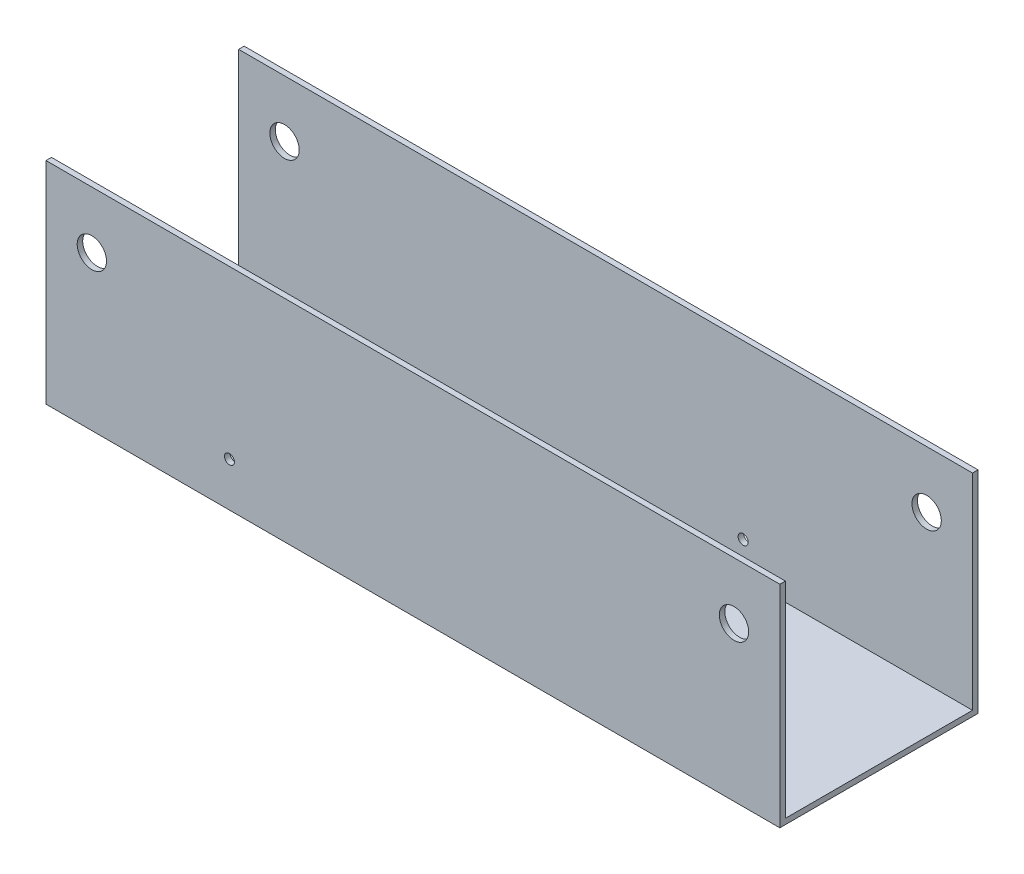
ISO-10303-21;
HEADER;
FILE_DESCRIPTION(('STEP AP214'),'2;1');
FILE_NAME('part.step','',(''),(''),'','','');
FILE_SCHEMA(('AUTOMOTIVE_DESIGN { 1 0 10303 214 1 1 1 1 }'));
ENDSEC;
DATA;
#1=APPLICATION_CONTEXT('core data for automotive mechanical design processes');
#2=APPLICATION_PROTOCOL_DEFINITION('international standard','automotive_design',2000,#1);
#3=PRODUCT_CONTEXT('',#1,'mechanical');
#4=PRODUCT('Part','Part','',(#3));
#5=PRODUCT_RELATED_PRODUCT_CATEGORY('part','',(#4));
#6=PRODUCT_DEFINITION_FORMATION('','',#4);
#7=PRODUCT_DEFINITION_CONTEXT('part definition',#1,'design');
#8=PRODUCT_DEFINITION('design','',#6,#7);
#9=PRODUCT_DEFINITION_SHAPE('','',#8);
#10=(LENGTH_UNIT() NAMED_UNIT(*) SI_UNIT(.MILLI.,.METRE.));
#11=(NAMED_UNIT(*) PLANE_ANGLE_UNIT() SI_UNIT($,.RADIAN.));
#12=(NAMED_UNIT(*) SI_UNIT($,.STERADIAN.) SOLID_ANGLE_UNIT());
#13=UNCERTAINTY_MEASURE_WITH_UNIT(LENGTH_MEASURE(1.E-05),#10,'distance_accuracy_value','');
#14=(GEOMETRIC_REPRESENTATION_CONTEXT(3) GLOBAL_UNCERTAINTY_ASSIGNED_CONTEXT((#13)) GLOBAL_UNIT_ASSIGNED_CONTEXT((#10,
#11,#12)) REPRESENTATION_CONTEXT('',''));
#15=CARTESIAN_POINT('',(0.,0.,0.));
#16=DIRECTION('',(0.,0.,1.));
#17=DIRECTION('',(1.,0.,0.));
#18=AXIS2_PLACEMENT_3D('',#15,#16,#17);
#19=CARTESIAN_POINT('',(-133.819507748405,158.,-39.4849589790338));
#20=DIRECTION('',(0.,0.,1.));
#21=DIRECTION('',(1.,0.,0.));
#22=AXIS2_PLACEMENT_3D('',#19,#20,#21);
#23=PLANE('',#22);
#24=CARTESIAN_POINT('',(-33.8195077484047,-25.95,-39.4849589790338));
#25=DIRECTION('',(0.,0.,1.));
#26=DIRECTION('',(1.,0.,0.));
#27=AXIS2_PLACEMENT_3D('',#24,#25,#26);
#28=CIRCLE('',#27,2.70000000000001);
#29=CARTESIAN_POINT('',(-31.1195077484047,-25.95,-39.4849589790338));
#30=VERTEX_POINT('',#29);
#31=EDGE_CURVE('E139',#30,#30,#28,.T.);
#32=ORIENTED_EDGE('',*,*,#31,.T.);
#33=EDGE_LOOP('',(#32));
#34=FACE_BOUND('',#33,.T.);
#35=CARTESIAN_POINT('',(241.180492251595,34.,-39.4849589790338));
#36=DIRECTION('',(0.,0.,1.));
#37=DIRECTION('',(1.,0.,0.));
#38=AXIS2_PLACEMENT_3D('',#35,#36,#37);
#39=CIRCLE('',#38,8.00000000000001);
#40=CARTESIAN_POINT('',(249.180492251595,34.,-39.4849589790338));
#41=VERTEX_POINT('',#40);
#42=EDGE_CURVE('E189',#41,#41,#39,.T.);
#43=ORIENTED_EDGE('',*,*,#42,.T.);
#44=EDGE_LOOP('',(#43));
#45=FACE_BOUND('',#44,.T.);
#46=CARTESIAN_POINT('',(-108.819507748405,34.,-39.4849589790338));
#47=DIRECTION('',(0.,0.,1.));
#48=DIRECTION('',(1.,0.,0.));
#49=AXIS2_PLACEMENT_3D('',#46,#47,#48);
#50=CIRCLE('',#49,8.00000000000001);
#51=CARTESIAN_POINT('',(-100.819507748405,34.,-39.4849589790338));
#52=VERTEX_POINT('',#51);
#53=EDGE_CURVE('E43',#52,#52,#50,.T.);
#54=ORIENTED_EDGE('',*,*,#53,.T.);
#55=EDGE_LOOP('',(#54));
#56=FACE_BOUND('',#55,.T.);
#57=DIRECTION('',(1.,0.,0.));
#58=VECTOR('',#57,1.);
#59=CARTESIAN_POINT('',(266.180492251595,-47.,-39.4849589790338));
#60=LINE('',#59,#58);
#61=CARTESIAN_POINT('',(-133.819507748405,-47.,-39.4849589790338));
#62=VERTEX_POINT('',#61);
#63=CARTESIAN_POINT('',(266.180492251595,-47.,-39.4849589790338));
#64=VERTEX_POINT('',#63);
#65=EDGE_CURVE('E54',#62,#64,#60,.T.);
#66=ORIENTED_EDGE('',*,*,#65,.F.);
#67=DIRECTION('',(0.,-1.,0.));
#68=VECTOR('',#67,1.);
#69=CARTESIAN_POINT('',(-133.819507748405,158.,-39.4849589790338));
#70=LINE('',#69,#68);
#71=CARTESIAN_POINT('',(-133.819507748405,65.,-39.4849589790338));
#72=VERTEX_POINT('',#71);
#73=EDGE_CURVE('E58',#72,#62,#70,.T.);
#74=ORIENTED_EDGE('',*,*,#73,.F.);
#75=DIRECTION('',(1.,0.,0.));
#76=VECTOR('',#75,1.);
#77=CARTESIAN_POINT('',(0.,65.,-39.4849589790338));
#78=LINE('',#77,#76);
#79=CARTESIAN_POINT('',(266.180492251595,65.,-39.4849589790338));
#80=VERTEX_POINT('',#79);
#81=EDGE_CURVE('E48',#72,#80,#78,.T.);
#82=ORIENTED_EDGE('',*,*,#81,.T.);
#83=DIRECTION('',(0.,-1.,0.));
#84=VECTOR('',#83,1.);
#85=CARTESIAN_POINT('',(266.180492251595,158.,-39.4849589790338));
#86=LINE('',#85,#84);
#87=EDGE_CURVE('E11',#80,#64,#86,.T.);
#88=ORIENTED_EDGE('',*,*,#87,.T.);
#89=EDGE_LOOP('',(#66,#74,#82,#88));
#90=FACE_BOUND('',#89,.T.);
#91=ADVANCED_FACE('F39',(#34,#45,#56,#90),#23,.F.);
#92=CARTESIAN_POINT('',(0.,65.,0.));
#93=DIRECTION('',(0.,1.,0.));
#94=DIRECTION('',(0.,0.,1.));
#95=AXIS2_PLACEMENT_3D('',#92,#93,#94);
#96=PLANE('',#95);
#97=ORIENTED_EDGE('',*,*,#81,.F.);
#98=DIRECTION('',(0.,0.,1.));
#99=VECTOR('',#98,1.);
#100=CARTESIAN_POINT('',(-133.819507748405,65.,-144.484958979034));
#101=LINE('',#100,#99);
#102=CARTESIAN_POINT('',(-133.819507748405,65.,-36.4849589790338));
#103=VERTEX_POINT('',#102);
#104=EDGE_CURVE('E73',#72,#103,#101,.T.);
#105=ORIENTED_EDGE('',*,*,#104,.T.);
#106=DIRECTION('',(1.,0.,0.));
#107=VECTOR('',#106,1.);
#108=CARTESIAN_POINT('',(-133.819507748405,65.,-36.4849589790338));
#109=LINE('',#108,#107);
#110=CARTESIAN_POINT('',(266.180492251595,65.,-36.4849589790338));
#111=VERTEX_POINT('',#110);
#112=EDGE_CURVE('E192',#103,#111,#109,.T.);
#113=ORIENTED_EDGE('',*,*,#112,.T.);
#114=DIRECTION('',(0.,0.,1.));
#115=VECTOR('',#114,1.);
#116=CARTESIAN_POINT('',(266.180492251595,65.,-144.484958979034));
#117=LINE('',#116,#115);
#118=EDGE_CURVE('E195',#80,#111,#117,.T.);
#119=ORIENTED_EDGE('',*,*,#118,.F.);
#120=EDGE_LOOP('',(#97,#105,#113,#119));
#121=FACE_BOUND('',#120,.T.);
#122=ADVANCED_FACE('F221',(#121),#96,.T.);
#123=CARTESIAN_POINT('',(-133.819507748405,65.,-144.484958979034));
#124=DIRECTION('',(1.,0.,0.));
#125=DIRECTION('',(0.,0.,-1.));
#126=AXIS2_PLACEMENT_3D('',#123,#124,#125);
#127=PLANE('',#126);
#128=ORIENTED_EDGE('',*,*,#104,.F.);
#129=ORIENTED_EDGE('',*,*,#73,.T.);
#130=DIRECTION('',(0.,0.,1.));
#131=VECTOR('',#130,1.);
#132=CARTESIAN_POINT('',(-133.819507748405,-47.,-141.484958979034));
#133=LINE('',#132,#131);
#134=CARTESIAN_POINT('',(-133.819507748405,-47.,-141.484958979034));
#135=VERTEX_POINT('',#134);
#136=EDGE_CURVE('E177',#135,#62,#133,.T.);
#137=ORIENTED_EDGE('',*,*,#136,.F.);
#138=DIRECTION('',(0.,-1.,0.));
#139=VECTOR('',#138,1.);
#140=CARTESIAN_POINT('',(-133.819507748405,158.,-141.484958979034));
#141=LINE('',#140,#139);
#142=CARTESIAN_POINT('',(-133.819507748405,65.,-141.484958979034));
#143=VERTEX_POINT('',#142);
#144=EDGE_CURVE('E156',#143,#135,#141,.T.);
#145=ORIENTED_EDGE('',*,*,#144,.F.);
#146=DIRECTION('',(0.,0.,1.));
#147=VECTOR('',#146,1.);
#148=CARTESIAN_POINT('',(-133.819507748405,65.,-144.484958979034));
#149=LINE('',#148,#147);
#150=CARTESIAN_POINT('',(-133.819507748405,65.,-144.484958979034));
#151=VERTEX_POINT('',#150);
#152=EDGE_CURVE('E159',#151,#143,#149,.T.);
#153=ORIENTED_EDGE('',*,*,#152,.F.);
#154=DIRECTION('',(0.,-1.,0.));
#155=VECTOR('',#154,1.);
#156=CARTESIAN_POINT('',(-133.819507748405,65.,-144.484958979034));
#157=LINE('',#156,#155);
#158=CARTESIAN_POINT('',(-133.819507748405,-50.,-144.484958979034));
#159=VERTEX_POINT('',#158);
#160=EDGE_CURVE('E133',#151,#159,#157,.T.);
#161=ORIENTED_EDGE('',*,*,#160,.T.);
#162=DIRECTION('',(0.,0.,-1.));
#163=VECTOR('',#162,1.);
#164=CARTESIAN_POINT('',(-133.819507748405,-50.,-36.4849589790338));
#165=LINE('',#164,#163);
#166=CARTESIAN_POINT('',(-133.819507748405,-50.,-36.4849589790338));
#167=VERTEX_POINT('',#166);
#168=EDGE_CURVE('E121',#167,#159,#165,.T.);
#169=ORIENTED_EDGE('',*,*,#168,.F.);
#170=DIRECTION('',(0.,-1.,0.));
#171=VECTOR('',#170,1.);
#172=CARTESIAN_POINT('',(-133.819507748405,65.,-36.4849589790338));
#173=LINE('',#172,#171);
#174=EDGE_CURVE('E84',#103,#167,#173,.T.);
#175=ORIENTED_EDGE('',*,*,#174,.F.);
#176=EDGE_LOOP('',(#128,#129,#137,#145,#153,#161,#169,#175));
#177=FACE_BOUND('',#176,.T.);
#178=ADVANCED_FACE('F41',(#177),#127,.F.);
#179=CARTESIAN_POINT('',(-133.819507748405,65.,-36.4849589790338));
#180=DIRECTION('',(0.,0.,-1.));
#181=DIRECTION('',(-1.,0.,0.));
#182=AXIS2_PLACEMENT_3D('',#179,#180,#181);
#183=PLANE('',#182);
#184=CARTESIAN_POINT('',(-33.8195077484047,-25.95,-36.4849589790338));
#185=DIRECTION('',(0.,0.,1.));
#186=DIRECTION('',(1.,0.,0.));
#187=AXIS2_PLACEMENT_3D('',#184,#185,#186);
#188=CIRCLE('',#187,2.70000000000001);
#189=CARTESIAN_POINT('',(-31.1195077484047,-25.95,-36.4849589790338));
#190=VERTEX_POINT('',#189);
#191=EDGE_CURVE('E149',#190,#190,#188,.T.);
#192=ORIENTED_EDGE('',*,*,#191,.F.);
#193=EDGE_LOOP('',(#192));
#194=FACE_BOUND('',#193,.T.);
#195=CARTESIAN_POINT('',(-108.819507748405,34.,-36.4849589790338));
#196=DIRECTION('',(0.,0.,1.));
#197=DIRECTION('',(1.,0.,0.));
#198=AXIS2_PLACEMENT_3D('',#195,#196,#197);
#199=CIRCLE('',#198,8.00000000000001);
#200=CARTESIAN_POINT('',(-100.819507748405,34.,-36.4849589790338));
#201=VERTEX_POINT('',#200);
#202=EDGE_CURVE('E184',#201,#201,#199,.T.);
#203=ORIENTED_EDGE('',*,*,#202,.F.);
#204=EDGE_LOOP('',(#203));
#205=FACE_BOUND('',#204,.T.);
#206=CARTESIAN_POINT('',(241.180492251595,34.,-36.4849589790338));
#207=DIRECTION('',(0.,0.,1.));
#208=DIRECTION('',(1.,0.,0.));
#209=AXIS2_PLACEMENT_3D('',#206,#207,#208);
#210=CIRCLE('',#209,8.00000000000001);
#211=CARTESIAN_POINT('',(249.180492251595,34.,-36.4849589790338));
#212=VERTEX_POINT('',#211);
#213=EDGE_CURVE('E183',#212,#212,#210,.T.);
#214=ORIENTED_EDGE('',*,*,#213,.F.);
#215=EDGE_LOOP('',(#214));
#216=FACE_BOUND('',#215,.T.);
#217=ORIENTED_EDGE('',*,*,#174,.T.);
#218=DIRECTION('',(-1.,0.,0.));
#219=VECTOR('',#218,1.);
#220=CARTESIAN_POINT('',(-133.819507748405,-50.,-36.4849589790338));
#221=LINE('',#220,#219);
#222=CARTESIAN_POINT('',(266.180492251595,-50.,-36.4849589790338));
#223=VERTEX_POINT('',#222);
#224=EDGE_CURVE('E124',#223,#167,#221,.T.);
#225=ORIENTED_EDGE('',*,*,#224,.F.);
#226=DIRECTION('',(0.,-1.,0.));
#227=VECTOR('',#226,1.);
#228=CARTESIAN_POINT('',(266.180492251595,65.,-36.4849589790338));
#229=LINE('',#228,#227);
#230=EDGE_CURVE('E90',#111,#223,#229,.T.);
#231=ORIENTED_EDGE('',*,*,#230,.F.);
#232=ORIENTED_EDGE('',*,*,#112,.F.);
#233=EDGE_LOOP('',(#217,#225,#231,#232));
#234=FACE_BOUND('',#233,.T.);
#235=ADVANCED_FACE('F233',(#194,#205,#216,#234),#183,.F.);
#236=CARTESIAN_POINT('',(266.180492251595,65.,-144.484958979034));
#237=DIRECTION('',(1.,0.,0.));
#238=DIRECTION('',(0.,0.,-1.));
#239=AXIS2_PLACEMENT_3D('',#236,#237,#238);
#240=PLANE('',#239);
#241=ORIENTED_EDGE('',*,*,#87,.F.);
#242=ORIENTED_EDGE('',*,*,#118,.T.);
#243=ORIENTED_EDGE('',*,*,#230,.T.);
#244=DIRECTION('',(0.,0.,1.));
#245=VECTOR('',#244,1.);
#246=CARTESIAN_POINT('',(266.180492251595,-50.,-36.4849589790338));
#247=LINE('',#246,#245);
#248=CARTESIAN_POINT('',(266.180492251595,-50.,-144.484958979034));
#249=VERTEX_POINT('',#248);
#250=EDGE_CURVE('E112',#249,#223,#247,.T.);
#251=ORIENTED_EDGE('',*,*,#250,.F.);
#252=DIRECTION('',(0.,-1.,0.));
#253=VECTOR('',#252,1.);
#254=CARTESIAN_POINT('',(266.180492251595,65.,-144.484958979034));
#255=LINE('',#254,#253);
#256=CARTESIAN_POINT('',(266.180492251595,65.,-144.484958979034));
#257=VERTEX_POINT('',#256);
#258=EDGE_CURVE('E118',#257,#249,#255,.T.);
#259=ORIENTED_EDGE('',*,*,#258,.F.);
#260=DIRECTION('',(0.,0.,1.));
#261=VECTOR('',#260,1.);
#262=CARTESIAN_POINT('',(266.180492251595,65.,-144.484958979034));
#263=LINE('',#262,#261);
#264=CARTESIAN_POINT('',(266.180492251595,65.,-141.484958979034));
#265=VERTEX_POINT('',#264);
#266=EDGE_CURVE('E164',#257,#265,#263,.T.);
#267=ORIENTED_EDGE('',*,*,#266,.T.);
#268=DIRECTION('',(0.,-1.,0.));
#269=VECTOR('',#268,1.);
#270=CARTESIAN_POINT('',(266.180492251595,158.,-141.484958979034));
#271=LINE('',#270,#269);
#272=CARTESIAN_POINT('',(266.180492251595,-47.,-141.484958979034));
#273=VERTEX_POINT('',#272);
#274=EDGE_CURVE('E160',#265,#273,#271,.T.);
#275=ORIENTED_EDGE('',*,*,#274,.T.);
#276=DIRECTION('',(0.,0.,1.));
#277=VECTOR('',#276,1.);
#278=CARTESIAN_POINT('',(266.180492251595,-47.,-141.484958979034));
#279=LINE('',#278,#277);
#280=EDGE_CURVE('E174',#273,#64,#279,.T.);
#281=ORIENTED_EDGE('',*,*,#280,.T.);
#282=EDGE_LOOP('',(#241,#242,#243,#251,#259,#267,#275,#281));
#283=FACE_BOUND('',#282,.T.);
#284=ADVANCED_FACE('F120',(#283),#240,.T.);
#285=CARTESIAN_POINT('',(241.180492251595,34.,-194.484958979034));
#286=DIRECTION('',(0.,0.,1.));
#287=DIRECTION('',(1.,0.,0.));
#288=AXIS2_PLACEMENT_3D('',#285,#286,#287);
#289=CYLINDRICAL_SURFACE('',#288,8.00000000000001);
#290=CARTESIAN_POINT('',(249.180492251595,34.,-36.4849589790338));
#291=CARTESIAN_POINT('',(249.180492251595,34.,-36.5162089790338));
#292=CARTESIAN_POINT('',(249.180492251595,34.,-36.5474589790338));
#293=CARTESIAN_POINT('',(249.180492251595,34.,-36.6099589790338));
#294=CARTESIAN_POINT('',(249.180492251595,34.,-36.6412089790338));
#295=CARTESIAN_POINT('',(249.180492251595,34.,-36.7037089790338));
#296=CARTESIAN_POINT('',(249.180492251595,34.,-36.7349589790338));
#297=CARTESIAN_POINT('',(249.180492251595,34.,-36.7974589790338));
#298=CARTESIAN_POINT('',(249.180492251595,34.,-36.8287089790338));
#299=CARTESIAN_POINT('',(249.180492251595,34.,-36.8912089790338));
#300=CARTESIAN_POINT('',(249.180492251595,34.,-36.9224589790338));
#301=CARTESIAN_POINT('',(249.180492251595,34.,-36.9849589790338));
#302=CARTESIAN_POINT('',(249.180492251595,34.,-37.0162089790338));
#303=CARTESIAN_POINT('',(249.180492251595,34.,-37.0787089790338));
#304=CARTESIAN_POINT('',(249.180492251595,34.,-37.1099589790338));
#305=CARTESIAN_POINT('',(249.180492251595,34.,-37.1724589790338));
#306=CARTESIAN_POINT('',(249.180492251595,34.,-37.2037089790338));
#307=CARTESIAN_POINT('',(249.180492251595,34.,-37.2662089790338));
#308=CARTESIAN_POINT('',(249.180492251595,34.,-37.2974589790338));
#309=CARTESIAN_POINT('',(249.180492251595,34.,-37.3599589790338));
#310=CARTESIAN_POINT('',(249.180492251595,34.,-37.3912089790338));
#311=CARTESIAN_POINT('',(249.180492251595,34.,-37.4537089790338));
#312=CARTESIAN_POINT('',(249.180492251595,34.,-37.4849589790338));
#313=CARTESIAN_POINT('',(249.180492251595,34.,-37.5474589790338));
#314=CARTESIAN_POINT('',(249.180492251595,34.,-37.5787089790338));
#315=CARTESIAN_POINT('',(249.180492251595,34.,-37.6412089790338));
#316=CARTESIAN_POINT('',(249.180492251595,34.,-37.6724589790338));
#317=CARTESIAN_POINT('',(249.180492251595,34.,-37.7349589790338));
#318=CARTESIAN_POINT('',(249.180492251595,34.,-37.7662089790338));
#319=CARTESIAN_POINT('',(249.180492251595,34.,-37.8287089790338));
#320=CARTESIAN_POINT('',(249.180492251595,34.,-37.8599589790338));
#321=CARTESIAN_POINT('',(249.180492251595,34.,-37.9224589790338));
#322=CARTESIAN_POINT('',(249.180492251595,34.,-37.9537089790338));
#323=CARTESIAN_POINT('',(249.180492251595,34.,-38.0162089790338));
#324=CARTESIAN_POINT('',(249.180492251595,34.,-38.0474589790338));
#325=CARTESIAN_POINT('',(249.180492251595,34.,-38.1099589790338));
#326=CARTESIAN_POINT('',(249.180492251595,34.,-38.1412089790338));
#327=CARTESIAN_POINT('',(249.180492251595,34.,-38.2037089790338));
#328=CARTESIAN_POINT('',(249.180492251595,34.,-38.2349589790338));
#329=CARTESIAN_POINT('',(249.180492251595,34.,-38.2974589790338));
#330=CARTESIAN_POINT('',(249.180492251595,34.,-38.3287089790338));
#331=CARTESIAN_POINT('',(249.180492251595,34.,-38.3912089790338));
#332=CARTESIAN_POINT('',(249.180492251595,34.,-38.4224589790338));
#333=CARTESIAN_POINT('',(249.180492251595,34.,-38.4849589790338));
#334=CARTESIAN_POINT('',(249.180492251595,34.,-38.5162089790338));
#335=CARTESIAN_POINT('',(249.180492251595,34.,-38.5787089790338));
#336=CARTESIAN_POINT('',(249.180492251595,34.,-38.6099589790338));
#337=CARTESIAN_POINT('',(249.180492251595,34.,-38.6724589790338));
#338=CARTESIAN_POINT('',(249.180492251595,34.,-38.7037089790338));
#339=CARTESIAN_POINT('',(249.180492251595,34.,-38.7662089790338));
#340=CARTESIAN_POINT('',(249.180492251595,34.,-38.7974589790338));
#341=CARTESIAN_POINT('',(249.180492251595,34.,-38.8599589790338));
#342=CARTESIAN_POINT('',(249.180492251595,34.,-38.8912089790338));
#343=CARTESIAN_POINT('',(249.180492251595,34.,-38.9537089790338));
#344=CARTESIAN_POINT('',(249.180492251595,34.,-38.9849589790338));
#345=CARTESIAN_POINT('',(249.180492251595,34.,-39.0474589790338));
#346=CARTESIAN_POINT('',(249.180492251595,34.,-39.0787089790338));
#347=CARTESIAN_POINT('',(249.180492251595,34.,-39.1412089790338));
#348=CARTESIAN_POINT('',(249.180492251595,34.,-39.1724589790338));
#349=CARTESIAN_POINT('',(249.180492251595,34.,-39.2349589790338));
#350=CARTESIAN_POINT('',(249.180492251595,34.,-39.2662089790338));
#351=CARTESIAN_POINT('',(249.180492251595,34.,-39.3287089790338));
#352=CARTESIAN_POINT('',(249.180492251595,34.,-39.3599589790338));
#353=CARTESIAN_POINT('',(249.180492251595,34.,-39.4224589790338));
#354=CARTESIAN_POINT('',(249.180492251595,34.,-39.4537089790338));
#355=CARTESIAN_POINT('',(249.180492251595,34.,-39.4849589790338));
#356=B_SPLINE_CURVE_WITH_KNOTS('',3,(#290,#291,#292,#293,#294,#295,#296,#297,#298,#299,#300,
#301,#302,#303,#304,#305,#306,#307,#308,#309,#310,#311,#312,#313,#314,#315,#316,#317,#318,#319,
#320,#321,#322,#323,#324,#325,#326,#327,#328,#329,#330,#331,#332,#333,#334,#335,#336,#337,#338,
#339,#340,#341,#342,#343,#344,#345,#346,#347,#348,#349,#350,#351,#352,#353,#354,#355),
.UNSPECIFIED.,.F.,.F.,(4,2,2,2,2,2,2,2,2,2,2,2,2,2,2,2,2,2,2,2,2,2,2,2,2,2,2,2,2,2,2,2,4),(0.,
0.0937500000000036,0.187500000000007,0.281250000000011,0.375000000000014,0.46874999999999,
0.562499999999994,0.656249999999997,0.750000000000001,0.843750000000004,0.937500000000008,
1.03125000000001,1.12499999999999,1.21874999999999,1.31249999999999,1.40625,1.5,1.59375,
1.68750000000001,1.78125000000001,1.87500000000002,1.96874999999999,2.06249999999999,2.15625,
2.25,2.34375000000001,2.43750000000001,2.53125000000001,2.62499999999999,2.71874999999999,
2.8125,2.90625,3.),.UNSPECIFIED.);
#357=EDGE_CURVE('BSEAM206',#212,#41,#356,.T.);
#358=ORIENTED_EDGE('',*,*,#213,.T.);
#359=ORIENTED_EDGE('',*,*,#42,.F.);
#360=ORIENTED_EDGE('',*,*,#357,.T.);
#361=ORIENTED_EDGE('',*,*,#357,.F.);
#362=EDGE_LOOP('',(#358,#360,#359,#361));
#363=FACE_BOUND('',#362,.T.);
#364=ADVANCED_FACE('F206',(#363),#289,.F.);
#365=CARTESIAN_POINT('',(-108.819507748405,34.,-194.484958979034));
#366=DIRECTION('',(0.,0.,1.));
#367=DIRECTION('',(1.,0.,0.));
#368=AXIS2_PLACEMENT_3D('',#365,#366,#367);
#369=CYLINDRICAL_SURFACE('',#368,8.00000000000001);
#370=CARTESIAN_POINT('',(-100.819507748405,34.,-36.4849589790338));
#371=CARTESIAN_POINT('',(-100.819507748405,34.,-36.5162089790338));
#372=CARTESIAN_POINT('',(-100.819507748405,34.,-36.5474589790338));
#373=CARTESIAN_POINT('',(-100.819507748405,34.,-36.6099589790338));
#374=CARTESIAN_POINT('',(-100.819507748405,34.,-36.6412089790338));
#375=CARTESIAN_POINT('',(-100.819507748405,34.,-36.7037089790338));
#376=CARTESIAN_POINT('',(-100.819507748405,34.,-36.7349589790338));
#377=CARTESIAN_POINT('',(-100.819507748405,34.,-36.7974589790338));
#378=CARTESIAN_POINT('',(-100.819507748405,34.,-36.8287089790338));
#379=CARTESIAN_POINT('',(-100.819507748405,34.,-36.8912089790338));
#380=CARTESIAN_POINT('',(-100.819507748405,34.,-36.9224589790338));
#381=CARTESIAN_POINT('',(-100.819507748405,34.,-36.9849589790338));
#382=CARTESIAN_POINT('',(-100.819507748405,34.,-37.0162089790338));
#383=CARTESIAN_POINT('',(-100.819507748405,34.,-37.0787089790338));
#384=CARTESIAN_POINT('',(-100.819507748405,34.,-37.1099589790338));
#385=CARTESIAN_POINT('',(-100.819507748405,34.,-37.1724589790338));
#386=CARTESIAN_POINT('',(-100.819507748405,34.,-37.2037089790338));
#387=CARTESIAN_POINT('',(-100.819507748405,34.,-37.2662089790338));
#388=CARTESIAN_POINT('',(-100.819507748405,34.,-37.2974589790338));
#389=CARTESIAN_POINT('',(-100.819507748405,34.,-37.3599589790338));
#390=CARTESIAN_POINT('',(-100.819507748405,34.,-37.3912089790338));
#391=CARTESIAN_POINT('',(-100.819507748405,34.,-37.4537089790338));
#392=CARTESIAN_POINT('',(-100.819507748405,34.,-37.4849589790338));
#393=CARTESIAN_POINT('',(-100.819507748405,34.,-37.5474589790338));
#394=CARTESIAN_POINT('',(-100.819507748405,34.,-37.5787089790338));
#395=CARTESIAN_POINT('',(-100.819507748405,34.,-37.6412089790338));
#396=CARTESIAN_POINT('',(-100.819507748405,34.,-37.6724589790338));
#397=CARTESIAN_POINT('',(-100.819507748405,34.,-37.7349589790338));
#398=CARTESIAN_POINT('',(-100.819507748405,34.,-37.7662089790338));
#399=CARTESIAN_POINT('',(-100.819507748405,34.,-37.8287089790338));
#400=CARTESIAN_POINT('',(-100.819507748405,34.,-37.8599589790338));
#401=CARTESIAN_POINT('',(-100.819507748405,34.,-37.9224589790338));
#402=CARTESIAN_POINT('',(-100.819507748405,34.,-37.9537089790338));
#403=CARTESIAN_POINT('',(-100.819507748405,34.,-38.0162089790338));
#404=CARTESIAN_POINT('',(-100.819507748405,34.,-38.0474589790338));
#405=CARTESIAN_POINT('',(-100.819507748405,34.,-38.1099589790338));
#406=CARTESIAN_POINT('',(-100.819507748405,34.,-38.1412089790338));
#407=CARTESIAN_POINT('',(-100.819507748405,34.,-38.2037089790338));
#408=CARTESIAN_POINT('',(-100.819507748405,34.,-38.2349589790338));
#409=CARTESIAN_POINT('',(-100.819507748405,34.,-38.2974589790338));
#410=CARTESIAN_POINT('',(-100.819507748405,34.,-38.3287089790338));
#411=CARTESIAN_POINT('',(-100.819507748405,34.,-38.3912089790338));
#412=CARTESIAN_POINT('',(-100.819507748405,34.,-38.4224589790338));
#413=CARTESIAN_POINT('',(-100.819507748405,34.,-38.4849589790338));
#414=CARTESIAN_POINT('',(-100.819507748405,34.,-38.5162089790338));
#415=CARTESIAN_POINT('',(-100.819507748405,34.,-38.5787089790338));
#416=CARTESIAN_POINT('',(-100.819507748405,34.,-38.6099589790338));
#417=CARTESIAN_POINT('',(-100.819507748405,34.,-38.6724589790338));
#418=CARTESIAN_POINT('',(-100.819507748405,34.,-38.7037089790338));
#419=CARTESIAN_POINT('',(-100.819507748405,34.,-38.7662089790338));
#420=CARTESIAN_POINT('',(-100.819507748405,34.,-38.7974589790338));
#421=CARTESIAN_POINT('',(-100.819507748405,34.,-38.8599589790338));
#422=CARTESIAN_POINT('',(-100.819507748405,34.,-38.8912089790338));
#423=CARTESIAN_POINT('',(-100.819507748405,34.,-38.9537089790338));
#424=CARTESIAN_POINT('',(-100.819507748405,34.,-38.9849589790338));
#425=CARTESIAN_POINT('',(-100.819507748405,34.,-39.0474589790338));
#426=CARTESIAN_POINT('',(-100.819507748405,34.,-39.0787089790338));
#427=CARTESIAN_POINT('',(-100.819507748405,34.,-39.1412089790338));
#428=CARTESIAN_POINT('',(-100.819507748405,34.,-39.1724589790338));
#429=CARTESIAN_POINT('',(-100.819507748405,34.,-39.2349589790338));
#430=CARTESIAN_POINT('',(-100.819507748405,34.,-39.2662089790338));
#431=CARTESIAN_POINT('',(-100.819507748405,34.,-39.3287089790338));
#432=CARTESIAN_POINT('',(-100.819507748405,34.,-39.3599589790338));
#433=CARTESIAN_POINT('',(-100.819507748405,34.,-39.4224589790338));
#434=CARTESIAN_POINT('',(-100.819507748405,34.,-39.4537089790338));
#435=CARTESIAN_POINT('',(-100.819507748405,34.,-39.4849589790338));
#436=B_SPLINE_CURVE_WITH_KNOTS('',3,(#370,#371,#372,#373,#374,#375,#376,#377,#378,#379,#380,
#381,#382,#383,#384,#385,#386,#387,#388,#389,#390,#391,#392,#393,#394,#395,#396,#397,#398,#399,
#400,#401,#402,#403,#404,#405,#406,#407,#408,#409,#410,#411,#412,#413,#414,#415,#416,#417,#418,
#419,#420,#421,#422,#423,#424,#425,#426,#427,#428,#429,#430,#431,#432,#433,#434,#435),
.UNSPECIFIED.,.F.,.F.,(4,2,2,2,2,2,2,2,2,2,2,2,2,2,2,2,2,2,2,2,2,2,2,2,2,2,2,2,2,2,2,2,4),(0.,
0.0937500000000036,0.187500000000007,0.281250000000011,0.375000000000014,0.46874999999999,
0.562499999999994,0.656249999999997,0.750000000000001,0.843750000000004,0.937500000000008,
1.03125000000001,1.12499999999999,1.21874999999999,1.31249999999999,1.40625,1.5,1.59375,
1.68750000000001,1.78125000000001,1.87500000000002,1.96874999999999,2.06249999999999,2.15625,
2.25,2.34375000000001,2.43750000000001,2.53125000000001,2.62499999999999,2.71874999999999,
2.8125,2.90625,3.),.UNSPECIFIED.);
#437=EDGE_CURVE('BSEAM207',#201,#52,#436,.T.);
#438=ORIENTED_EDGE('',*,*,#202,.T.);
#439=ORIENTED_EDGE('',*,*,#53,.F.);
#440=ORIENTED_EDGE('',*,*,#437,.T.);
#441=ORIENTED_EDGE('',*,*,#437,.F.);
#442=EDGE_LOOP('',(#438,#440,#439,#441));
#443=FACE_BOUND('',#442,.T.);
#444=ADVANCED_FACE('F207',(#443),#369,.F.);
#445=CARTESIAN_POINT('',(0.,-50.,0.));
#446=DIRECTION('',(0.,-1.,0.));
#447=DIRECTION('',(0.,0.,-1.));
#448=AXIS2_PLACEMENT_3D('',#445,#446,#447);
#449=PLANE('',#448);
#450=ORIENTED_EDGE('',*,*,#168,.T.);
#451=DIRECTION('',(1.,0.,0.));
#452=VECTOR('',#451,1.);
#453=CARTESIAN_POINT('',(-133.819507748405,-50.,-144.484958979034));
#454=LINE('',#453,#452);
#455=EDGE_CURVE('E127',#159,#249,#454,.T.);
#456=ORIENTED_EDGE('',*,*,#455,.T.);
#457=ORIENTED_EDGE('',*,*,#250,.T.);
#458=ORIENTED_EDGE('',*,*,#224,.T.);
#459=EDGE_LOOP('',(#450,#456,#457,#458));
#460=FACE_BOUND('',#459,.T.);
#461=ADVANCED_FACE('F136',(#460),#449,.T.);
#462=CARTESIAN_POINT('',(266.180492251595,-47.,-141.484958979034));
#463=DIRECTION('',(0.,-1.,0.));
#464=DIRECTION('',(0.,0.,-1.));
#465=AXIS2_PLACEMENT_3D('',#462,#463,#464);
#466=PLANE('',#465);
#467=ORIENTED_EDGE('',*,*,#65,.T.);
#468=ORIENTED_EDGE('',*,*,#280,.F.);
#469=DIRECTION('',(1.,0.,0.));
#470=VECTOR('',#469,1.);
#471=CARTESIAN_POINT('',(266.180492251595,-47.,-141.484958979034));
#472=LINE('',#471,#470);
#473=EDGE_CURVE('E175',#135,#273,#472,.T.);
#474=ORIENTED_EDGE('',*,*,#473,.F.);
#475=ORIENTED_EDGE('',*,*,#136,.T.);
#476=EDGE_LOOP('',(#467,#468,#474,#475));
#477=FACE_BOUND('',#476,.T.);
#478=ADVANCED_FACE('F219',(#477),#466,.F.);
#479=CARTESIAN_POINT('',(-133.819507748405,158.,-141.484958979034));
#480=DIRECTION('',(0.,0.,-1.));
#481=DIRECTION('',(-1.,0.,0.));
#482=AXIS2_PLACEMENT_3D('',#479,#480,#481);
#483=PLANE('',#482);
#484=CARTESIAN_POINT('',(141.180492251595,-28.85,-141.484958979034));
#485=DIRECTION('',(0.,0.,-1.));
#486=DIRECTION('',(-1.,0.,0.));
#487=AXIS2_PLACEMENT_3D('',#484,#485,#486);
#488=CIRCLE('',#487,2.75000000000001);
#489=CARTESIAN_POINT('',(138.430492251595,-28.85,-141.484958979034));
#490=VERTEX_POINT('',#489);
#491=EDGE_CURVE('E247',#490,#490,#488,.T.);
#492=ORIENTED_EDGE('',*,*,#491,.T.);
#493=EDGE_LOOP('',(#492));
#494=FACE_BOUND('',#493,.T.);
#495=CARTESIAN_POINT('',(-108.819507748405,34.,-141.484958979034));
#496=DIRECTION('',(0.,0.,-1.));
#497=DIRECTION('',(-1.,0.,0.));
#498=AXIS2_PLACEMENT_3D('',#495,#496,#497);
#499=CIRCLE('',#498,8.00000000000001);
#500=CARTESIAN_POINT('',(-100.819507748405,34.,-141.484958979034));
#501=VERTEX_POINT('',#500);
#502=EDGE_CURVE('E151',#501,#501,#499,.T.);
#503=ORIENTED_EDGE('',*,*,#502,.T.);
#504=EDGE_LOOP('',(#503));
#505=FACE_BOUND('',#504,.T.);
#506=CARTESIAN_POINT('',(241.180492251595,34.,-141.484958979034));
#507=DIRECTION('',(0.,0.,-1.));
#508=DIRECTION('',(-1.,0.,0.));
#509=AXIS2_PLACEMENT_3D('',#506,#507,#508);
#510=CIRCLE('',#509,8.00000000000001);
#511=CARTESIAN_POINT('',(249.180492251595,34.,-141.484958979034));
#512=VERTEX_POINT('',#511);
#513=EDGE_CURVE('E138',#512,#512,#510,.T.);
#514=ORIENTED_EDGE('',*,*,#513,.T.);
#515=EDGE_LOOP('',(#514));
#516=FACE_BOUND('',#515,.T.);
#517=ORIENTED_EDGE('',*,*,#144,.T.);
#518=ORIENTED_EDGE('',*,*,#473,.T.);
#519=ORIENTED_EDGE('',*,*,#274,.F.);
#520=DIRECTION('',(-1.,0.,0.));
#521=VECTOR('',#520,1.);
#522=CARTESIAN_POINT('',(0.,65.,-141.484958979034));
#523=LINE('',#522,#521);
#524=EDGE_CURVE('E135',#265,#143,#523,.T.);
#525=ORIENTED_EDGE('',*,*,#524,.T.);
#526=EDGE_LOOP('',(#517,#518,#519,#525));
#527=FACE_BOUND('',#526,.T.);
#528=ADVANCED_FACE('F261',(#494,#505,#516,#527),#483,.F.);
#529=CARTESIAN_POINT('',(-133.819507748405,65.,-144.484958979034));
#530=DIRECTION('',(0.,0.,-1.));
#531=DIRECTION('',(-1.,0.,0.));
#532=AXIS2_PLACEMENT_3D('',#529,#530,#531);
#533=PLANE('',#532);
#534=CARTESIAN_POINT('',(141.180492251595,-28.85,-144.484958979034));
#535=DIRECTION('',(0.,0.,-1.));
#536=DIRECTION('',(-1.,0.,0.));
#537=AXIS2_PLACEMENT_3D('',#534,#535,#536);
#538=CIRCLE('',#537,2.75000000000001);
#539=CARTESIAN_POINT('',(138.430492251595,-28.85,-144.484958979034));
#540=VERTEX_POINT('',#539);
#541=EDGE_CURVE('E249',#540,#540,#538,.T.);
#542=ORIENTED_EDGE('',*,*,#541,.F.);
#543=EDGE_LOOP('',(#542));
#544=FACE_BOUND('',#543,.T.);
#545=CARTESIAN_POINT('',(-108.819507748405,34.,-144.484958979034));
#546=DIRECTION('',(0.,0.,-1.));
#547=DIRECTION('',(-1.,0.,0.));
#548=AXIS2_PLACEMENT_3D('',#545,#546,#547);
#549=CIRCLE('',#548,8.00000000000001);
#550=CARTESIAN_POINT('',(-100.819507748405,34.,-144.484958979034));
#551=VERTEX_POINT('',#550);
#552=EDGE_CURVE('E155',#551,#551,#549,.T.);
#553=ORIENTED_EDGE('',*,*,#552,.F.);
#554=EDGE_LOOP('',(#553));
#555=FACE_BOUND('',#554,.T.);
#556=CARTESIAN_POINT('',(241.180492251595,34.,-144.484958979034));
#557=DIRECTION('',(0.,0.,-1.));
#558=DIRECTION('',(-1.,0.,0.));
#559=AXIS2_PLACEMENT_3D('',#556,#557,#558);
#560=CIRCLE('',#559,8.00000000000001);
#561=CARTESIAN_POINT('',(249.180492251595,34.,-144.484958979034));
#562=VERTEX_POINT('',#561);
#563=EDGE_CURVE('E141',#562,#562,#560,.T.);
#564=ORIENTED_EDGE('',*,*,#563,.F.);
#565=EDGE_LOOP('',(#564));
#566=FACE_BOUND('',#565,.T.);
#567=ORIENTED_EDGE('',*,*,#258,.T.);
#568=ORIENTED_EDGE('',*,*,#455,.F.);
#569=ORIENTED_EDGE('',*,*,#160,.F.);
#570=DIRECTION('',(1.,0.,0.));
#571=VECTOR('',#570,1.);
#572=CARTESIAN_POINT('',(-133.819507748405,65.,-144.484958979034));
#573=LINE('',#572,#571);
#574=EDGE_CURVE('E131',#151,#257,#573,.T.);
#575=ORIENTED_EDGE('',*,*,#574,.T.);
#576=EDGE_LOOP('',(#567,#568,#569,#575));
#577=FACE_BOUND('',#576,.T.);
#578=ADVANCED_FACE('F128',(#544,#555,#566,#577),#533,.T.);
#579=CARTESIAN_POINT('',(0.,65.,0.));
#580=DIRECTION('',(0.,1.,0.));
#581=DIRECTION('',(0.,0.,1.));
#582=AXIS2_PLACEMENT_3D('',#579,#580,#581);
#583=PLANE('',#582);
#584=ORIENTED_EDGE('',*,*,#524,.F.);
#585=ORIENTED_EDGE('',*,*,#266,.F.);
#586=ORIENTED_EDGE('',*,*,#574,.F.);
#587=ORIENTED_EDGE('',*,*,#152,.T.);
#588=EDGE_LOOP('',(#584,#585,#586,#587));
#589=FACE_BOUND('',#588,.T.);
#590=ADVANCED_FACE('F264',(#589),#583,.T.);
#591=CARTESIAN_POINT('',(241.180492251595,34.,-194.484958979034));
#592=DIRECTION('',(0.,0.,1.));
#593=DIRECTION('',(1.,0.,0.));
#594=AXIS2_PLACEMENT_3D('',#591,#592,#593);
#595=CYLINDRICAL_SURFACE('',#594,8.00000000000001);
#596=CARTESIAN_POINT('',(249.180492251595,34.,-144.484958979034));
#597=CARTESIAN_POINT('',(249.180492251595,34.,-144.453708979034));
#598=CARTESIAN_POINT('',(249.180492251595,34.,-144.422458979034));
#599=CARTESIAN_POINT('',(249.180492251595,34.,-144.359958979034));
#600=CARTESIAN_POINT('',(249.180492251595,34.,-144.328708979034));
#601=CARTESIAN_POINT('',(249.180492251595,34.,-144.266208979034));
#602=CARTESIAN_POINT('',(249.180492251595,34.,-144.234958979034));
#603=CARTESIAN_POINT('',(249.180492251595,34.,-144.172458979034));
#604=CARTESIAN_POINT('',(249.180492251595,34.,-144.141208979034));
#605=CARTESIAN_POINT('',(249.180492251595,34.,-144.078708979034));
#606=CARTESIAN_POINT('',(249.180492251595,34.,-144.047458979034));
#607=CARTESIAN_POINT('',(249.180492251595,34.,-143.984958979034));
#608=CARTESIAN_POINT('',(249.180492251595,34.,-143.953708979034));
#609=CARTESIAN_POINT('',(249.180492251595,34.,-143.891208979034));
#610=CARTESIAN_POINT('',(249.180492251595,34.,-143.859958979034));
#611=CARTESIAN_POINT('',(249.180492251595,34.,-143.797458979034));
#612=CARTESIAN_POINT('',(249.180492251595,34.,-143.766208979034));
#613=CARTESIAN_POINT('',(249.180492251595,34.,-143.703708979034));
#614=CARTESIAN_POINT('',(249.180492251595,34.,-143.672458979034));
#615=CARTESIAN_POINT('',(249.180492251595,34.,-143.609958979034));
#616=CARTESIAN_POINT('',(249.180492251595,34.,-143.578708979034));
#617=CARTESIAN_POINT('',(249.180492251595,34.,-143.516208979034));
#618=CARTESIAN_POINT('',(249.180492251595,34.,-143.484958979034));
#619=CARTESIAN_POINT('',(249.180492251595,34.,-143.422458979034));
#620=CARTESIAN_POINT('',(249.180492251595,34.,-143.391208979034));
#621=CARTESIAN_POINT('',(249.180492251595,34.,-143.328708979034));
#622=CARTESIAN_POINT('',(249.180492251595,34.,-143.297458979034));
#623=CARTESIAN_POINT('',(249.180492251595,34.,-143.234958979034));
#624=CARTESIAN_POINT('',(249.180492251595,34.,-143.203708979034));
#625=CARTESIAN_POINT('',(249.180492251595,34.,-143.141208979034));
#626=CARTESIAN_POINT('',(249.180492251595,34.,-143.109958979034));
#627=CARTESIAN_POINT('',(249.180492251595,34.,-143.047458979034));
#628=CARTESIAN_POINT('',(249.180492251595,34.,-143.016208979034));
#629=CARTESIAN_POINT('',(249.180492251595,34.,-142.953708979034));
#630=CARTESIAN_POINT('',(249.180492251595,34.,-142.922458979034));
#631=CARTESIAN_POINT('',(249.180492251595,34.,-142.859958979034));
#632=CARTESIAN_POINT('',(249.180492251595,34.,-142.828708979034));
#633=CARTESIAN_POINT('',(249.180492251595,34.,-142.766208979034));
#634=CARTESIAN_POINT('',(249.180492251595,34.,-142.734958979034));
#635=CARTESIAN_POINT('',(249.180492251595,34.,-142.672458979034));
#636=CARTESIAN_POINT('',(249.180492251595,34.,-142.641208979034));
#637=CARTESIAN_POINT('',(249.180492251595,34.,-142.578708979034));
#638=CARTESIAN_POINT('',(249.180492251595,34.,-142.547458979034));
#639=CARTESIAN_POINT('',(249.180492251595,34.,-142.484958979034));
#640=CARTESIAN_POINT('',(249.180492251595,34.,-142.453708979034));
#641=CARTESIAN_POINT('',(249.180492251595,34.,-142.391208979034));
#642=CARTESIAN_POINT('',(249.180492251595,34.,-142.359958979034));
#643=CARTESIAN_POINT('',(249.180492251595,34.,-142.297458979034));
#644=CARTESIAN_POINT('',(249.180492251595,34.,-142.266208979034));
#645=CARTESIAN_POINT('',(249.180492251595,34.,-142.203708979034));
#646=CARTESIAN_POINT('',(249.180492251595,34.,-142.172458979034));
#647=CARTESIAN_POINT('',(249.180492251595,34.,-142.109958979034));
#648=CARTESIAN_POINT('',(249.180492251595,34.,-142.078708979034));
#649=CARTESIAN_POINT('',(249.180492251595,34.,-142.016208979034));
#650=CARTESIAN_POINT('',(249.180492251595,34.,-141.984958979034));
#651=CARTESIAN_POINT('',(249.180492251595,34.,-141.922458979034));
#652=CARTESIAN_POINT('',(249.180492251595,34.,-141.891208979034));
#653=CARTESIAN_POINT('',(249.180492251595,34.,-141.828708979034));
#654=CARTESIAN_POINT('',(249.180492251595,34.,-141.797458979034));
#655=CARTESIAN_POINT('',(249.180492251595,34.,-141.734958979034));
#656=CARTESIAN_POINT('',(249.180492251595,34.,-141.703708979034));
#657=CARTESIAN_POINT('',(249.180492251595,34.,-141.641208979034));
#658=CARTESIAN_POINT('',(249.180492251595,34.,-141.609958979034));
#659=CARTESIAN_POINT('',(249.180492251595,34.,-141.547458979034));
#660=CARTESIAN_POINT('',(249.180492251595,34.,-141.516208979034));
#661=CARTESIAN_POINT('',(249.180492251595,34.,-141.484958979034));
#662=B_SPLINE_CURVE_WITH_KNOTS('',3,(#596,#597,#598,#599,#600,#601,#602,#603,#604,#605,#606,
#607,#608,#609,#610,#611,#612,#613,#614,#615,#616,#617,#618,#619,#620,#621,#622,#623,#624,#625,
#626,#627,#628,#629,#630,#631,#632,#633,#634,#635,#636,#637,#638,#639,#640,#641,#642,#643,#644,
#645,#646,#647,#648,#649,#650,#651,#652,#653,#654,#655,#656,#657,#658,#659,#660,#661),
.UNSPECIFIED.,.F.,.F.,(4,2,2,2,2,2,2,2,2,2,2,2,2,2,2,2,2,2,2,2,2,2,2,2,2,2,2,2,2,2,2,2,4),(0.,
0.0937500000000036,0.187500000000007,0.281250000000011,0.375000000000014,0.468750000000018,
0.562499999999994,0.656249999999997,0.750000000000001,0.843750000000004,0.937500000000008,
1.03125000000001,1.12500000000001,1.21875000000002,1.31250000000002,1.40625,1.5,1.59375,
1.68750000000001,1.78125000000001,1.87500000000002,1.96875000000002,2.06249999999999,2.15625,
2.25,2.34375000000001,2.43750000000001,2.53125000000001,2.62500000000002,2.71875000000002,
2.81250000000002,2.90625,3.),.UNSPECIFIED.);
#663=EDGE_CURVE('BSEAM267',#562,#512,#662,.T.);
#664=ORIENTED_EDGE('',*,*,#563,.T.);
#665=ORIENTED_EDGE('',*,*,#513,.F.);
#666=ORIENTED_EDGE('',*,*,#663,.T.);
#667=ORIENTED_EDGE('',*,*,#663,.F.);
#668=EDGE_LOOP('',(#664,#666,#665,#667));
#669=FACE_BOUND('',#668,.T.);
#670=ADVANCED_FACE('F267',(#669),#595,.F.);
#671=CARTESIAN_POINT('',(-108.819507748405,34.,-194.484958979034));
#672=DIRECTION('',(0.,0.,1.));
#673=DIRECTION('',(1.,0.,0.));
#674=AXIS2_PLACEMENT_3D('',#671,#672,#673);
#675=CYLINDRICAL_SURFACE('',#674,8.00000000000001);
#676=CARTESIAN_POINT('',(-100.819507748405,34.,-144.484958979034));
#677=CARTESIAN_POINT('',(-100.819507748405,34.,-144.453708979034));
#678=CARTESIAN_POINT('',(-100.819507748405,34.,-144.422458979034));
#679=CARTESIAN_POINT('',(-100.819507748405,34.,-144.359958979034));
#680=CARTESIAN_POINT('',(-100.819507748405,34.,-144.328708979034));
#681=CARTESIAN_POINT('',(-100.819507748405,34.,-144.266208979034));
#682=CARTESIAN_POINT('',(-100.819507748405,34.,-144.234958979034));
#683=CARTESIAN_POINT('',(-100.819507748405,34.,-144.172458979034));
#684=CARTESIAN_POINT('',(-100.819507748405,34.,-144.141208979034));
#685=CARTESIAN_POINT('',(-100.819507748405,34.,-144.078708979034));
#686=CARTESIAN_POINT('',(-100.819507748405,34.,-144.047458979034));
#687=CARTESIAN_POINT('',(-100.819507748405,34.,-143.984958979034));
#688=CARTESIAN_POINT('',(-100.819507748405,34.,-143.953708979034));
#689=CARTESIAN_POINT('',(-100.819507748405,34.,-143.891208979034));
#690=CARTESIAN_POINT('',(-100.819507748405,34.,-143.859958979034));
#691=CARTESIAN_POINT('',(-100.819507748405,34.,-143.797458979034));
#692=CARTESIAN_POINT('',(-100.819507748405,34.,-143.766208979034));
#693=CARTESIAN_POINT('',(-100.819507748405,34.,-143.703708979034));
#694=CARTESIAN_POINT('',(-100.819507748405,34.,-143.672458979034));
#695=CARTESIAN_POINT('',(-100.819507748405,34.,-143.609958979034));
#696=CARTESIAN_POINT('',(-100.819507748405,34.,-143.578708979034));
#697=CARTESIAN_POINT('',(-100.819507748405,34.,-143.516208979034));
#698=CARTESIAN_POINT('',(-100.819507748405,34.,-143.484958979034));
#699=CARTESIAN_POINT('',(-100.819507748405,34.,-143.422458979034));
#700=CARTESIAN_POINT('',(-100.819507748405,34.,-143.391208979034));
#701=CARTESIAN_POINT('',(-100.819507748405,34.,-143.328708979034));
#702=CARTESIAN_POINT('',(-100.819507748405,34.,-143.297458979034));
#703=CARTESIAN_POINT('',(-100.819507748405,34.,-143.234958979034));
#704=CARTESIAN_POINT('',(-100.819507748405,34.,-143.203708979034));
#705=CARTESIAN_POINT('',(-100.819507748405,34.,-143.141208979034));
#706=CARTESIAN_POINT('',(-100.819507748405,34.,-143.109958979034));
#707=CARTESIAN_POINT('',(-100.819507748405,34.,-143.047458979034));
#708=CARTESIAN_POINT('',(-100.819507748405,34.,-143.016208979034));
#709=CARTESIAN_POINT('',(-100.819507748405,34.,-142.953708979034));
#710=CARTESIAN_POINT('',(-100.819507748405,34.,-142.922458979034));
#711=CARTESIAN_POINT('',(-100.819507748405,34.,-142.859958979034));
#712=CARTESIAN_POINT('',(-100.819507748405,34.,-142.828708979034));
#713=CARTESIAN_POINT('',(-100.819507748405,34.,-142.766208979034));
#714=CARTESIAN_POINT('',(-100.819507748405,34.,-142.734958979034));
#715=CARTESIAN_POINT('',(-100.819507748405,34.,-142.672458979034));
#716=CARTESIAN_POINT('',(-100.819507748405,34.,-142.641208979034));
#717=CARTESIAN_POINT('',(-100.819507748405,34.,-142.578708979034));
#718=CARTESIAN_POINT('',(-100.819507748405,34.,-142.547458979034));
#719=CARTESIAN_POINT('',(-100.819507748405,34.,-142.484958979034));
#720=CARTESIAN_POINT('',(-100.819507748405,34.,-142.453708979034));
#721=CARTESIAN_POINT('',(-100.819507748405,34.,-142.391208979034));
#722=CARTESIAN_POINT('',(-100.819507748405,34.,-142.359958979034));
#723=CARTESIAN_POINT('',(-100.819507748405,34.,-142.297458979034));
#724=CARTESIAN_POINT('',(-100.819507748405,34.,-142.266208979034));
#725=CARTESIAN_POINT('',(-100.819507748405,34.,-142.203708979034));
#726=CARTESIAN_POINT('',(-100.819507748405,34.,-142.172458979034));
#727=CARTESIAN_POINT('',(-100.819507748405,34.,-142.109958979034));
#728=CARTESIAN_POINT('',(-100.819507748405,34.,-142.078708979034));
#729=CARTESIAN_POINT('',(-100.819507748405,34.,-142.016208979034));
#730=CARTESIAN_POINT('',(-100.819507748405,34.,-141.984958979034));
#731=CARTESIAN_POINT('',(-100.819507748405,34.,-141.922458979034));
#732=CARTESIAN_POINT('',(-100.819507748405,34.,-141.891208979034));
#733=CARTESIAN_POINT('',(-100.819507748405,34.,-141.828708979034));
#734=CARTESIAN_POINT('',(-100.819507748405,34.,-141.797458979034));
#735=CARTESIAN_POINT('',(-100.819507748405,34.,-141.734958979034));
#736=CARTESIAN_POINT('',(-100.819507748405,34.,-141.703708979034));
#737=CARTESIAN_POINT('',(-100.819507748405,34.,-141.641208979034));
#738=CARTESIAN_POINT('',(-100.819507748405,34.,-141.609958979034));
#739=CARTESIAN_POINT('',(-100.819507748405,34.,-141.547458979034));
#740=CARTESIAN_POINT('',(-100.819507748405,34.,-141.516208979034));
#741=CARTESIAN_POINT('',(-100.819507748405,34.,-141.484958979034));
#742=B_SPLINE_CURVE_WITH_KNOTS('',3,(#676,#677,#678,#679,#680,#681,#682,#683,#684,#685,#686,
#687,#688,#689,#690,#691,#692,#693,#694,#695,#696,#697,#698,#699,#700,#701,#702,#703,#704,#705,
#706,#707,#708,#709,#710,#711,#712,#713,#714,#715,#716,#717,#718,#719,#720,#721,#722,#723,#724,
#725,#726,#727,#728,#729,#730,#731,#732,#733,#734,#735,#736,#737,#738,#739,#740,#741),
.UNSPECIFIED.,.F.,.F.,(4,2,2,2,2,2,2,2,2,2,2,2,2,2,2,2,2,2,2,2,2,2,2,2,2,2,2,2,2,2,2,2,4),(0.,
0.0937500000000036,0.187500000000007,0.281250000000011,0.375000000000014,0.468750000000018,
0.562499999999994,0.656249999999997,0.750000000000001,0.843750000000004,0.937500000000008,
1.03125000000001,1.12500000000001,1.21875000000002,1.31250000000002,1.40625,1.5,1.59375,
1.68750000000001,1.78125000000001,1.87500000000002,1.96875000000002,2.06249999999999,2.15625,
2.25,2.34375000000001,2.43750000000001,2.53125000000001,2.62500000000002,2.71875000000002,
2.81250000000002,2.90625,3.),.UNSPECIFIED.);
#743=EDGE_CURVE('BSEAM272',#551,#501,#742,.T.);
#744=ORIENTED_EDGE('',*,*,#552,.T.);
#745=ORIENTED_EDGE('',*,*,#502,.F.);
#746=ORIENTED_EDGE('',*,*,#743,.T.);
#747=ORIENTED_EDGE('',*,*,#743,.F.);
#748=EDGE_LOOP('',(#744,#746,#745,#747));
#749=FACE_BOUND('',#748,.T.);
#750=ADVANCED_FACE('F272',(#749),#675,.F.);
#751=CARTESIAN_POINT('',(-33.8195077484047,-25.95,-111.484958979034));
#752=DIRECTION('',(0.,0.,1.));
#753=DIRECTION('',(1.,0.,0.));
#754=AXIS2_PLACEMENT_3D('',#751,#752,#753);
#755=CYLINDRICAL_SURFACE('',#754,2.70000000000001);
#756=ORIENTED_EDGE('',*,*,#191,.T.);
#757=EDGE_LOOP('',(#756));
#758=FACE_BOUND('',#757,.T.);
#759=ORIENTED_EDGE('',*,*,#31,.F.);
#760=EDGE_LOOP('',(#759));
#761=FACE_BOUND('',#760,.T.);
#762=ADVANCED_FACE('F295',(#758,#761),#755,.F.);
#763=CARTESIAN_POINT('',(141.180492251595,-28.85,-69.4849589790338));
#764=DIRECTION('',(0.,0.,-1.));
#765=DIRECTION('',(-1.,0.,0.));
#766=AXIS2_PLACEMENT_3D('',#763,#764,#765);
#767=CYLINDRICAL_SURFACE('',#766,2.75000000000001);
#768=ORIENTED_EDGE('',*,*,#541,.T.);
#769=EDGE_LOOP('',(#768));
#770=FACE_BOUND('',#769,.T.);
#771=ORIENTED_EDGE('',*,*,#491,.F.);
#772=EDGE_LOOP('',(#771));
#773=FACE_BOUND('',#772,.T.);
#774=ADVANCED_FACE('F259',(#770,#773),#767,.F.);
#775=CLOSED_SHELL('',(#91,#122,#178,#235,#284,#364,#444,#461,#478,#528,#578,#590,#670,#750,#762,#774));
#776=MANIFOLD_SOLID_BREP('B2',#775);
#777=ADVANCED_BREP_SHAPE_REPRESENTATION('',(#18,#776),#14);
#778=SHAPE_DEFINITION_REPRESENTATION(#9,#777);
ENDSEC;
END-ISO-10303-21;
